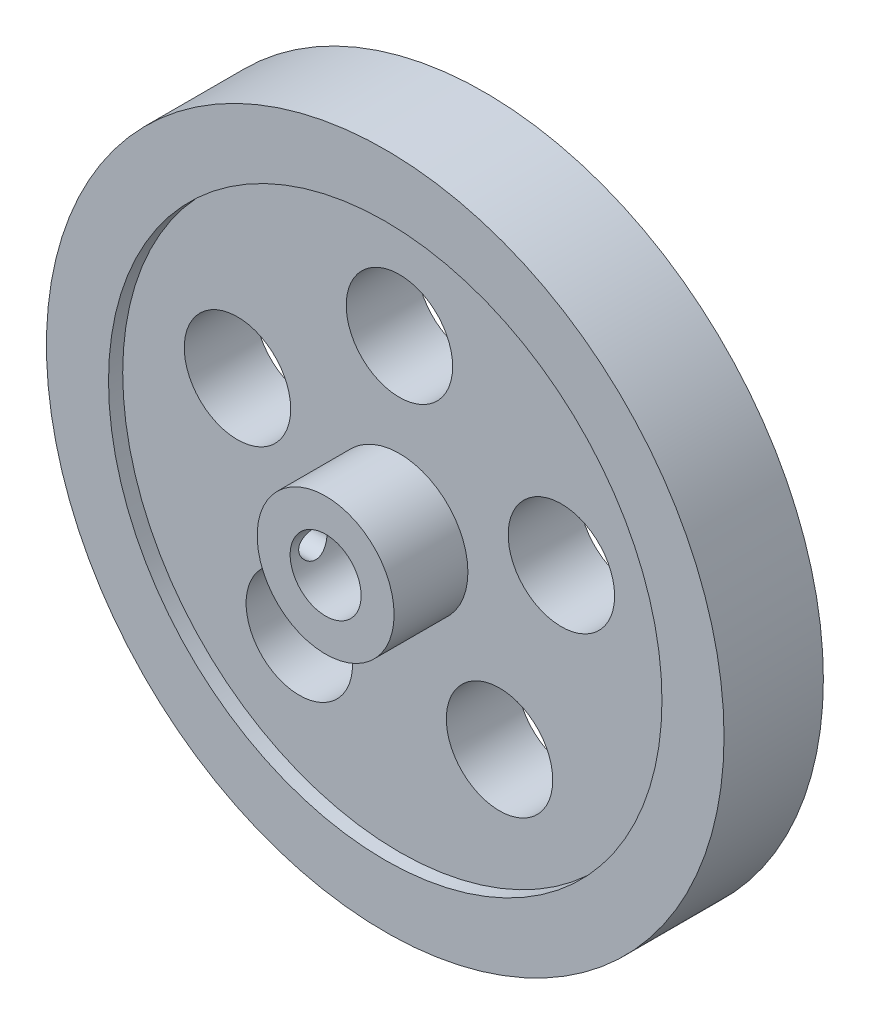
ISO-10303-21;
HEADER;
FILE_DESCRIPTION(('STEP AP214'),'2;1');
FILE_NAME('part.step','',(''),(''),'','','');
FILE_SCHEMA(('AUTOMOTIVE_DESIGN { 1 0 10303 214 1 1 1 1 }'));
ENDSEC;
DATA;
#1=APPLICATION_CONTEXT('core data for automotive mechanical design processes');
#2=APPLICATION_PROTOCOL_DEFINITION('international standard','automotive_design',2000,#1);
#3=PRODUCT_CONTEXT('',#1,'mechanical');
#4=PRODUCT('Part','Part','',(#3));
#5=PRODUCT_RELATED_PRODUCT_CATEGORY('part','',(#4));
#6=PRODUCT_DEFINITION_FORMATION('','',#4);
#7=PRODUCT_DEFINITION_CONTEXT('part definition',#1,'design');
#8=PRODUCT_DEFINITION('design','',#6,#7);
#9=PRODUCT_DEFINITION_SHAPE('','',#8);
#10=(LENGTH_UNIT() NAMED_UNIT(*) SI_UNIT(.MILLI.,.METRE.));
#11=(NAMED_UNIT(*) PLANE_ANGLE_UNIT() SI_UNIT($,.RADIAN.));
#12=(NAMED_UNIT(*) SI_UNIT($,.STERADIAN.) SOLID_ANGLE_UNIT());
#13=UNCERTAINTY_MEASURE_WITH_UNIT(LENGTH_MEASURE(1.E-05),#10,'distance_accuracy_value','');
#14=(GEOMETRIC_REPRESENTATION_CONTEXT(3) GLOBAL_UNCERTAINTY_ASSIGNED_CONTEXT((#13)) GLOBAL_UNIT_ASSIGNED_CONTEXT((#10,
#11,#12)) REPRESENTATION_CONTEXT('',''));
#15=CARTESIAN_POINT('',(0.,0.,0.));
#16=DIRECTION('',(0.,0.,1.));
#17=DIRECTION('',(1.,0.,0.));
#18=AXIS2_PLACEMENT_3D('',#15,#16,#17);
#19=CARTESIAN_POINT('',(0.,0.,0.));
#20=DIRECTION('',(0.,0.,1.));
#21=DIRECTION('',(1.,0.,0.));
#22=AXIS2_PLACEMENT_3D('',#19,#20,#21);
#23=PLANE('',#22);
#24=CARTESIAN_POINT('',(0.,0.,0.));
#25=DIRECTION('',(0.,0.,1.));
#26=DIRECTION('',(1.,0.,0.));
#27=AXIS2_PLACEMENT_3D('',#24,#25,#26);
#28=CIRCLE('',#27,5.);
#29=CARTESIAN_POINT('',(5.,0.,0.));
#30=VERTEX_POINT('',#29);
#31=EDGE_CURVE('E51',#30,#30,#28,.F.);
#32=ORIENTED_EDGE('',*,*,#31,.F.);
#33=EDGE_LOOP('',(#32));
#34=FACE_BOUND('',#33,.T.);
#35=CARTESIAN_POINT('',(0.,0.,0.));
#36=DIRECTION('',(0.,0.,-1.));
#37=DIRECTION('',(-1.,0.,0.));
#38=AXIS2_PLACEMENT_3D('',#35,#36,#37);
#39=CIRCLE('',#38,9.65);
#40=CARTESIAN_POINT('',(-9.65,0.,0.));
#41=VERTEX_POINT('',#40);
#42=EDGE_CURVE('E156',#41,#41,#39,.T.);
#43=ORIENTED_EDGE('',*,*,#42,.T.);
#44=EDGE_LOOP('',(#43));
#45=FACE_BOUND('',#44,.T.);
#46=ADVANCED_FACE('F36',(#34,#45),#23,.F.);
#47=CARTESIAN_POINT('',(0.,0.,14.));
#48=DIRECTION('',(0.,0.,-1.));
#49=DIRECTION('',(-1.,0.,0.));
#50=AXIS2_PLACEMENT_3D('',#47,#48,#49);
#51=CYLINDRICAL_SURFACE('',#50,47.75);
#52=CARTESIAN_POINT('',(0.,0.,14.));
#53=DIRECTION('',(0.,0.,1.));
#54=DIRECTION('',(1.,0.,0.));
#55=AXIS2_PLACEMENT_3D('',#52,#53,#54);
#56=CIRCLE('',#55,47.75);
#57=CARTESIAN_POINT('',(47.75,0.,14.));
#58=VERTEX_POINT('',#57);
#59=EDGE_CURVE('E10',#58,#58,#56,.T.);
#60=ORIENTED_EDGE('',*,*,#59,.F.);
#61=EDGE_LOOP('',(#60));
#62=FACE_BOUND('',#61,.T.);
#63=CARTESIAN_POINT('',(0.,0.,0.));
#64=DIRECTION('',(0.,0.,1.));
#65=DIRECTION('',(1.,0.,0.));
#66=AXIS2_PLACEMENT_3D('',#63,#64,#65);
#67=CIRCLE('',#66,47.75);
#68=CARTESIAN_POINT('',(47.75,0.,0.));
#69=VERTEX_POINT('',#68);
#70=EDGE_CURVE('E40',#69,#69,#67,.T.);
#71=ORIENTED_EDGE('',*,*,#70,.T.);
#72=EDGE_LOOP('',(#71));
#73=FACE_BOUND('',#72,.T.);
#74=ADVANCED_FACE('F38',(#62,#73),#51,.T.);
#75=CARTESIAN_POINT('',(0.,0.,14.));
#76=DIRECTION('',(0.,0.,1.));
#77=DIRECTION('',(1.,0.,0.));
#78=AXIS2_PLACEMENT_3D('',#75,#76,#77);
#79=PLANE('',#78);
#80=CARTESIAN_POINT('',(0.,0.,14.));
#81=DIRECTION('',(0.,0.,1.));
#82=DIRECTION('',(1.,0.,0.));
#83=AXIS2_PLACEMENT_3D('',#80,#81,#82);
#84=CIRCLE('',#83,39.);
#85=CARTESIAN_POINT('',(39.,0.,14.));
#86=VERTEX_POINT('',#85);
#87=EDGE_CURVE('E162',#86,#86,#84,.T.);
#88=ORIENTED_EDGE('',*,*,#87,.F.);
#89=EDGE_LOOP('',(#88));
#90=FACE_BOUND('',#89,.T.);
#91=ORIENTED_EDGE('',*,*,#59,.T.);
#92=EDGE_LOOP('',(#91));
#93=FACE_BOUND('',#92,.T.);
#94=ADVANCED_FACE('F126',(#90,#93),#79,.T.);
#95=CARTESIAN_POINT('',(0.,0.,0.));
#96=DIRECTION('',(0.,0.,-1.));
#97=DIRECTION('',(-1.,0.,0.));
#98=AXIS2_PLACEMENT_3D('',#95,#96,#97);
#99=CIRCLE('',#98,39.);
#100=CARTESIAN_POINT('',(-39.,0.,0.));
#101=VERTEX_POINT('',#100);
#102=EDGE_CURVE('E145',#101,#101,#99,.T.);
#103=ORIENTED_EDGE('',*,*,#102,.F.);
#104=EDGE_LOOP('',(#103));
#105=FACE_BOUND('',#104,.T.);
#106=ORIENTED_EDGE('',*,*,#70,.F.);
#107=EDGE_LOOP('',(#106));
#108=FACE_BOUND('',#107,.T.);
#109=ADVANCED_FACE('F122',(#105,#108),#23,.F.);
#110=CARTESIAN_POINT('',(0.,0.,22.4));
#111=DIRECTION('',(0.,0.,-1.));
#112=DIRECTION('',(-1.,0.,0.));
#113=AXIS2_PLACEMENT_3D('',#110,#111,#112);
#114=CYLINDRICAL_SURFACE('',#113,9.65);
#115=CARTESIAN_POINT('',(-9.65,0.,17.2));
#116=CARTESIAN_POINT('',(-9.64999794464458,-0.111067549874396,17.2000039809148));
#117=CARTESIAN_POINT('',(-9.64806287965716,-0.222184567795648,17.2092832533697));
#118=CARTESIAN_POINT('',(-9.64053026455785,-0.441271956577384,17.2461222853959));
#119=CARTESIAN_POINT('',(-9.63492991522329,-0.549239856534918,17.2736960168918));
#120=CARTESIAN_POINT('',(-9.6206914116801,-0.758830216635555,17.3462308754117));
#121=CARTESIAN_POINT('',(-9.61205626798986,-0.860458848123323,17.3911747756038));
#122=CARTESIAN_POINT('',(-9.59268434466928,-1.05472730461767,17.4971216492004));
#123=CARTESIAN_POINT('',(-9.58194766325775,-1.14736754940868,17.5581238721388));
#124=CARTESIAN_POINT('',(-9.55937831455363,-1.3223776589053,17.6953922736931));
#125=CARTESIAN_POINT('',(-9.54753322683512,-1.40459855250622,17.7718463585199));
#126=CARTESIAN_POINT('',(-9.5241713569897,-1.5551454019171,17.9374444924869));
#127=CARTESIAN_POINT('',(-9.51265460189488,-1.62347021646735,18.0265895828949));
#128=CARTESIAN_POINT('',(-9.49113166207302,-1.74492825527537,18.216122096468));
#129=CARTESIAN_POINT('',(-9.48114143451689,-1.79790558771567,18.3166113927097));
#130=CARTESIAN_POINT('',(-9.46397981260919,-1.88616565866308,18.5253067569492));
#131=CARTESIAN_POINT('',(-9.45680811792375,-1.92145028255944,18.6335120013077));
#132=CARTESIAN_POINT('',(-9.44622156220574,-1.97283641138792,18.8529598441987));
#133=CARTESIAN_POINT('',(-9.44275538644913,-1.98920020228043,18.9641384986318));
#134=CARTESIAN_POINT('',(-9.43981800017677,-2.00309517059189,19.1877130450989));
#135=CARTESIAN_POINT('',(-9.44034635025036,-2.00062841943056,19.3001088018895));
#136=CARTESIAN_POINT('',(-9.44529175763588,-1.97714401267965,19.5209965270891));
#137=CARTESIAN_POINT('',(-9.44964546844672,-1.95642853455584,19.6295222535482));
#138=CARTESIAN_POINT('',(-9.46165114682741,-1.89751235121026,19.8415238001854));
#139=CARTESIAN_POINT('',(-9.46930328236104,-1.85931075554697,19.9449993628982));
#140=CARTESIAN_POINT('',(-9.48710748696465,-1.76622240421973,20.1448260583641));
#141=CARTESIAN_POINT('',(-9.49727719787424,-1.71121723241819,20.2411203904099));
#142=CARTESIAN_POINT('',(-9.51895955139653,-1.58616656369473,20.4232250121083));
#143=CARTESIAN_POINT('',(-9.53047235916012,-1.51611921625328,20.5090340097937));
#144=CARTESIAN_POINT('',(-9.55381714579632,-1.36136159178585,20.66947434836));
#145=CARTESIAN_POINT('',(-9.56565098943414,-1.27639376318513,20.743857210663));
#146=CARTESIAN_POINT('',(-9.58810085982896,-1.09505939888339,20.8773552784657));
#147=CARTESIAN_POINT('',(-9.59871686867413,-0.998692695570653,20.9364702594222));
#148=CARTESIAN_POINT('',(-9.61756405545909,-0.797009794039315,21.0378062548417));
#149=CARTESIAN_POINT('',(-9.62579099573014,-0.691678116619201,21.0799972999809));
#150=CARTESIAN_POINT('',(-9.63890120748899,-0.475212761275096,21.1460144198266));
#151=CARTESIAN_POINT('',(-9.64378491452272,-0.364079841149833,21.1698428868031));
#152=CARTESIAN_POINT('',(-9.64959723648176,-0.141300445319505,21.1981030358968));
#153=CARTESIAN_POINT('',(-9.6505951317267,-0.0296988285568837,21.2028745257505));
#154=CARTESIAN_POINT('',(-9.64871647190994,0.192706883326542,21.1938026408776));
#155=CARTESIAN_POINT('',(-9.64584015151528,0.303511026342835,21.1799603936131));
#156=CARTESIAN_POINT('',(-9.63657973860674,0.520069033230207,21.1343360954804));
#157=CARTESIAN_POINT('',(-9.63023004024345,0.6258615390357,21.1027298645163));
#158=CARTESIAN_POINT('',(-9.61473266780794,0.830644681118043,21.0226680512863));
#159=CARTESIAN_POINT('',(-9.60558477284902,0.929634779664239,20.9742111388041));
#160=CARTESIAN_POINT('',(-9.58533372731224,1.11942571724695,20.8610986191325));
#161=CARTESIAN_POINT('',(-9.57420666740675,1.21010313463923,20.7962402962832));
#162=CARTESIAN_POINT('',(-9.55128484858604,1.37940922834545,20.6524357643333));
#163=CARTESIAN_POINT('',(-9.53949001251252,1.45803650841794,20.5734879249801));
#164=CARTESIAN_POINT('',(-9.51632626631181,1.60233402226305,20.4021936300892));
#165=CARTESIAN_POINT('',(-9.50496753606827,1.6677701856174,20.3096483738895));
#166=CARTESIAN_POINT('',(-9.48418486531277,1.78217055107529,20.114680876373));
#167=CARTESIAN_POINT('',(-9.47476084463142,1.83113543576,20.0122590445746));
#168=CARTESIAN_POINT('',(-9.45899829905757,1.91089136989409,19.8009768822329));
#169=CARTESIAN_POINT('',(-9.45264323260316,1.94178004505181,19.6921546976911));
#170=CARTESIAN_POINT('',(-9.4437049456861,1.98479932688707,19.4707177929529));
#171=CARTESIAN_POINT('',(-9.44112119200855,1.99693258535247,19.3581036111998));
#172=CARTESIAN_POINT('',(-9.44004920141565,2.00199285362991,19.1346331399692));
#173=CARTESIAN_POINT('',(-9.44148199676175,1.99529018257166,19.0237854509742));
#174=CARTESIAN_POINT('',(-9.44810441375105,1.96369014977928,18.8048348783413));
#175=CARTESIAN_POINT('',(-9.4532940001312,1.9387929588277,18.6967319689494));
#176=CARTESIAN_POINT('',(-9.46680873673811,1.87168109239339,18.486597333189));
#177=CARTESIAN_POINT('',(-9.47512507802142,1.82951503860804,18.3845494745906));
#178=CARTESIAN_POINT('',(-9.49396068130323,1.7291062488135,18.1889197883973));
#179=CARTESIAN_POINT('',(-9.50448014520901,1.67086203915069,18.0953387378775));
#180=CARTESIAN_POINT('',(-9.52677618087913,1.53869924868473,17.9174619973726));
#181=CARTESIAN_POINT('',(-9.53857215693292,1.46451454148023,17.8333664351426));
#182=CARTESIAN_POINT('',(-9.56195627064366,1.30312231714444,17.678695508169));
#183=CARTESIAN_POINT('',(-9.57354435984323,1.21591180683035,17.6081232594621));
#184=CARTESIAN_POINT('',(-9.5953630478078,1.02974838920573,17.4817389881261));
#185=CARTESIAN_POINT('',(-9.60557668171413,0.930673051828243,17.4261042368842));
#186=CARTESIAN_POINT('',(-9.6233275921834,0.724392053217509,17.3323631832866));
#187=CARTESIAN_POINT('',(-9.63086721696164,0.617193626299359,17.2942414928798));
#188=CARTESIAN_POINT('',(-9.64100062330069,0.424835856448213,17.2437710937315));
#189=CARTESIAN_POINT('',(-9.64435520949992,0.340751961664246,17.2273869605512));
#190=CARTESIAN_POINT('',(-9.64885564961866,0.171121797952337,17.2055000773237));
#191=CARTESIAN_POINT('',(-9.65000158361499,0.0855755821557099,17.1999969327756));
#192=CARTESIAN_POINT('',(-9.65,0.,17.2));
#193=B_SPLINE_CURVE_WITH_KNOTS('',3,(#115,#116,#117,#118,#119,#120,#121,#122,#123,#124,#125,
#126,#127,#128,#129,#130,#131,#132,#133,#134,#135,#136,#137,#138,#139,#140,#141,#142,#143,#144,
#145,#146,#147,#148,#149,#150,#151,#152,#153,#154,#155,#156,#157,#158,#159,#160,#161,#162,#163,
#164,#165,#166,#167,#168,#169,#170,#171,#172,#173,#174,#175,#176,#177,#178,#179,#180,#181,#182,
#183,#184,#185,#186,#187,#188,#189,#190,#191,#192),.UNSPECIFIED.,.T.,.F.,(4,2,2,2,2,2,2,2,2,2,2,
2,2,2,2,2,2,2,2,2,2,2,2,2,2,2,2,2,2,2,2,2,2,2,2,2,2,2,4),(0.,0.332889521725542,
0.666033572399015,0.998848072414477,1.33164702151236,1.66876710575374,2.00591486588437,
2.34637589811653,2.68680064206304,3.02244750051138,3.35805743726642,3.68821238149429,
4.01838413999704,4.35093852443112,4.68353384385416,5.02256630723218,5.361603756443,
5.70123895884065,6.04082990620445,6.37433777737039,6.70782544837295,7.03806910611385,
7.36833883967369,7.70290919571149,8.03751828893392,8.37762417229575,8.71771595969785,
9.05595361669132,9.39414344661754,9.72573115578423,10.0573157525485,10.3879730987145,
10.718660761559,11.0553704937058,11.3921577173313,11.7327808841835,12.073104183451,
12.3295989700538,12.5860844570157),.UNSPECIFIED.);
#194=CARTESIAN_POINT('',(-9.65,0.,17.2));
#195=VERTEX_POINT('',#194);
#196=EDGE_CURVE('E57',#195,#195,#193,.T.);
#197=ORIENTED_EDGE('',*,*,#196,.F.);
#198=EDGE_LOOP('',(#197));
#199=FACE_BOUND('',#198,.T.);
#200=CARTESIAN_POINT('',(0.,0.,22.4));
#201=DIRECTION('',(0.,0.,1.));
#202=DIRECTION('',(1.,0.,0.));
#203=AXIS2_PLACEMENT_3D('',#200,#201,#202);
#204=CIRCLE('',#203,9.65);
#205=CARTESIAN_POINT('',(9.65,0.,22.4));
#206=VERTEX_POINT('',#205);
#207=EDGE_CURVE('E47',#206,#206,#204,.T.);
#208=ORIENTED_EDGE('',*,*,#207,.F.);
#209=EDGE_LOOP('',(#208));
#210=FACE_BOUND('',#209,.T.);
#211=CARTESIAN_POINT('',(0.,0.,12.));
#212=DIRECTION('',(0.,0.,1.));
#213=DIRECTION('',(1.,0.,0.));
#214=AXIS2_PLACEMENT_3D('',#211,#212,#213);
#215=CIRCLE('',#214,9.65);
#216=CARTESIAN_POINT('',(9.65,0.,12.));
#217=VERTEX_POINT('',#216);
#218=EDGE_CURVE('E153',#217,#217,#215,.T.);
#219=ORIENTED_EDGE('',*,*,#218,.T.);
#220=EDGE_LOOP('',(#219));
#221=FACE_BOUND('',#220,.T.);
#222=ADVANCED_FACE('F132',(#199,#210,#221),#114,.T.);
#223=CARTESIAN_POINT('',(0.,0.,22.4));
#224=DIRECTION('',(0.,0.,1.));
#225=DIRECTION('',(1.,0.,0.));
#226=AXIS2_PLACEMENT_3D('',#223,#224,#225);
#227=PLANE('',#226);
#228=CARTESIAN_POINT('',(0.,0.,22.4));
#229=DIRECTION('',(0.,0.,1.));
#230=DIRECTION('',(1.,0.,0.));
#231=AXIS2_PLACEMENT_3D('',#228,#229,#230);
#232=CIRCLE('',#231,5.);
#233=CARTESIAN_POINT('',(5.,0.,22.4));
#234=VERTEX_POINT('',#233);
#235=EDGE_CURVE('E54',#234,#234,#232,.T.);
#236=ORIENTED_EDGE('',*,*,#235,.F.);
#237=EDGE_LOOP('',(#236));
#238=FACE_BOUND('',#237,.T.);
#239=ORIENTED_EDGE('',*,*,#207,.T.);
#240=EDGE_LOOP('',(#239));
#241=FACE_BOUND('',#240,.T.);
#242=ADVANCED_FACE('F138',(#238,#241),#227,.T.);
#243=CARTESIAN_POINT('',(0.,0.,-14.1421356237309));
#244=DIRECTION('',(0.,0.,1.));
#245=DIRECTION('',(1.,0.,0.));
#246=AXIS2_PLACEMENT_3D('',#243,#244,#245);
#247=CYLINDRICAL_SURFACE('',#246,5.);
#248=CARTESIAN_POINT('',(-5.,0.,17.2));
#249=CARTESIAN_POINT('',(-4.99999271227085,0.107493005442891,17.2000098518237));
#250=CARTESIAN_POINT('',(-4.99649294306933,0.215172564090673,17.2087177520884));
#251=CARTESIAN_POINT('',(-4.98283453100642,0.427496480417896,17.2432477035212));
#252=CARTESIAN_POINT('',(-4.97265778698877,0.532131777561249,17.2691162790861));
#253=CARTESIAN_POINT('',(-4.94674209213118,0.734953922727404,17.3368760780588));
#254=CARTESIAN_POINT('',(-4.93102136364072,0.833160661616959,17.3787148462167));
#255=CARTESIAN_POINT('',(-4.89556610796078,1.02107197032837,17.4770191733265));
#256=CARTESIAN_POINT('',(-4.87583297458057,1.11077947675099,17.5334796549189));
#257=CARTESIAN_POINT('',(-4.83330886170419,1.28350100757039,17.6622354985609));
#258=CARTESIAN_POINT('',(-4.8104229692919,1.36606227255021,17.7351066562403));
#259=CARTESIAN_POINT('',(-4.76460576906194,1.51817500478472,17.8934000034768));
#260=CARTESIAN_POINT('',(-4.74167444453792,1.58772010713353,17.9788282972117));
#261=CARTESIAN_POINT('',(-4.69722791797136,1.71487456729288,18.1644280702423));
#262=CARTESIAN_POINT('',(-4.67582115964951,1.77181498119547,18.2650864860232));
#263=CARTESIAN_POINT('',(-4.63833647186792,1.86775471903715,18.47553639842));
#264=CARTESIAN_POINT('',(-4.62225601244176,1.90676256428584,18.5853235278484));
#265=CARTESIAN_POINT('',(-4.59826357660818,1.96389882339587,18.8057123335921));
#266=CARTESIAN_POINT('',(-4.59001420355605,1.98289396580565,18.9160512355762));
#267=CARTESIAN_POINT('',(-4.58164004049144,2.00217296164003,19.1386349983073));
#268=CARTESIAN_POINT('',(-4.58151125522768,2.00246601631323,19.250878894625));
#269=CARTESIAN_POINT('',(-4.58910500279994,1.98498936750455,19.465756671458));
#270=CARTESIAN_POINT('',(-4.5962817503845,1.96847531430514,19.568515714409));
#271=CARTESIAN_POINT('',(-4.61676187607836,1.91994688029782,19.7696595560067));
#272=CARTESIAN_POINT('',(-4.63006632321673,1.88792979480463,19.8680435881103));
#273=CARTESIAN_POINT('',(-4.6615948508853,1.80869473255107,20.060017836196));
#274=CARTESIAN_POINT('',(-4.67991379280788,1.76117986231532,20.1534692390547));
#275=CARTESIAN_POINT('',(-4.7193811638989,1.65250646073222,20.3314158163616));
#276=CARTESIAN_POINT('',(-4.74053065456848,1.59134280510085,20.4159076094028));
#277=CARTESIAN_POINT('',(-4.78526736742271,1.45155059945444,20.580409728802));
#278=CARTESIAN_POINT('',(-4.80891664976152,1.37193746297064,20.659568729446));
#279=CARTESIAN_POINT('',(-4.85459824958282,1.20031442743019,20.803684478002));
#280=CARTESIAN_POINT('',(-4.87663024445325,1.10830206533443,20.8686383974103));
#281=CARTESIAN_POINT('',(-4.91714681264548,0.912077652605843,20.9836174474158));
#282=CARTESIAN_POINT('',(-4.93555270095415,0.807660491346477,21.0333222811971));
#283=CARTESIAN_POINT('',(-4.96614828328759,0.591023765482881,21.1141678610781));
#284=CARTESIAN_POINT('',(-4.97834113462382,0.478808196849674,21.1453180375574));
#285=CARTESIAN_POINT('',(-4.99456139506911,0.25689588760782,21.1864482954197));
#286=CARTESIAN_POINT('',(-4.99902945833514,0.147443293985535,21.1975724542536));
#287=CARTESIAN_POINT('',(-5.00068478510631,-0.0718453098078173,21.2017131005286));
#288=CARTESIAN_POINT('',(-4.99787393582291,-0.181681213223924,21.1947342815475));
#289=CARTESIAN_POINT('',(-4.98557567063753,-0.393432739121987,21.163708247448));
#290=CARTESIAN_POINT('',(-4.97639391345523,-0.495482491775474,21.140442019649));
#291=CARTESIAN_POINT('',(-4.952594414055,-0.69413542806078,21.0785642916902));
#292=CARTESIAN_POINT('',(-4.9379759735653,-0.790737910224845,21.0399508203313));
#293=CARTESIAN_POINT('',(-4.90416594770812,-0.979078785816702,20.9472150603201));
#294=CARTESIAN_POINT('',(-4.88484815979804,-1.07057802275541,20.8926545279569));
#295=CARTESIAN_POINT('',(-4.84373364745525,-1.24344359124656,20.7700596760944));
#296=CARTESIAN_POINT('',(-4.8219359311027,-1.32480584076113,20.7020199570774));
#297=CARTESIAN_POINT('',(-4.77645117638112,-1.48072304302882,20.5491299870504));
#298=CARTESIAN_POINT('',(-4.75273441425052,-1.55447393380607,20.4634664584938));
#299=CARTESIAN_POINT('',(-4.70741672917132,-1.68675119741371,20.2805599169906));
#300=CARTESIAN_POINT('',(-4.68581615526511,-1.74527506133751,20.1833149996601));
#301=CARTESIAN_POINT('',(-4.64714299907708,-1.84580750193163,19.9785383054059));
#302=CARTESIAN_POINT('',(-4.63011630884788,-1.88765059453445,19.8709160007877));
#303=CARTESIAN_POINT('',(-4.60323673477931,-1.95229621970531,19.6492663482849));
#304=CARTESIAN_POINT('',(-4.59337855695998,-1.97511280526932,19.5352437941876));
#305=CARTESIAN_POINT('',(-4.58271759299926,-1.9997156172784,19.3128720982255));
#306=CARTESIAN_POINT('',(-4.58131421008171,-2.00289708230287,19.2047051604067));
#307=CARTESIAN_POINT('',(-4.58614836033098,-1.99180315927753,18.9894551422867));
#308=CARTESIAN_POINT('',(-4.59238492324793,-1.97752998791378,18.8823719260974));
#309=CARTESIAN_POINT('',(-4.6112664907902,-1.93307136615365,18.676667810145));
#310=CARTESIAN_POINT('',(-4.62364831827449,-1.90353749357098,18.577879725567));
#311=CARTESIAN_POINT('',(-4.65324001232696,-1.83000544849101,18.3866213703865));
#312=CARTESIAN_POINT('',(-4.67045121206007,-1.78600328139382,18.2941528531002));
#313=CARTESIAN_POINT('',(-4.70898609604491,-1.68187276275973,18.1123903807292));
#314=CARTESIAN_POINT('',(-4.73048882313242,-1.62096533515949,18.0235813298695));
#315=CARTESIAN_POINT('',(-4.77463804372237,-1.4858921192715,17.8570066827962));
#316=CARTESIAN_POINT('',(-4.79728488048406,-1.41172233481813,17.7792444278717));
#317=CARTESIAN_POINT('',(-4.84293567087394,-1.24650550627247,17.6317971467364));
#318=CARTESIAN_POINT('',(-4.86586757962185,-1.15467600114614,17.5629626931019));
#319=CARTESIAN_POINT('',(-4.90800406713717,-0.959900320285783,17.4416629573784));
#320=CARTESIAN_POINT('',(-4.92720691092906,-0.85694900454724,17.3892052878475));
#321=CARTESIAN_POINT('',(-4.95939714815861,-0.644738062495205,17.3033777848097));
#322=CARTESIAN_POINT('',(-4.97249363055028,-0.535631618219698,17.2696706764397));
#323=CARTESIAN_POINT('',(-4.99144306209366,-0.312876546281222,17.2213608790457));
#324=CARTESIAN_POINT('',(-4.99731899495638,-0.199243525858913,17.2066975632561));
#325=CARTESIAN_POINT('',(-4.99975899504136,-0.0569122978909301,17.2006046190217));
#326=CARTESIAN_POINT('',(-5.00000192969176,-0.0284626887407586,17.1999973913708));
#327=CARTESIAN_POINT('',(-5.,0.,17.2));
#328=B_SPLINE_CURVE_WITH_KNOTS('',3,(#248,#249,#250,#251,#252,#253,#254,#255,#256,#257,#258,
#259,#260,#261,#262,#263,#264,#265,#266,#267,#268,#269,#270,#271,#272,#273,#274,#275,#276,#277,
#278,#279,#280,#281,#282,#283,#284,#285,#286,#287,#288,#289,#290,#291,#292,#293,#294,#295,#296,
#297,#298,#299,#300,#301,#302,#303,#304,#305,#306,#307,#308,#309,#310,#311,#312,#313,#314,#315,
#316,#317,#318,#319,#320,#321,#322,#323,#324,#325,#326,#327),.UNSPECIFIED.,.T.,.F.,(4,2,2,2,2,2,
2,2,2,2,2,2,2,2,2,2,2,2,2,2,2,2,2,2,2,2,2,2,2,2,2,2,2,2,2,2,2,2,2,4),(0.,0.322402987893071,
0.645683636007935,0.967911457471581,1.29002753567984,1.62597381700397,1.96208394934412,
2.31315258819217,2.66405423118268,2.99904105308829,3.33386306340488,3.64538328401373,
3.95695787256048,4.27489126298817,4.59294421938184,4.93558349186558,5.27829092839734,
5.62776913162807,5.97706956113791,6.30569184528008,6.63422893570083,6.94800455564366,
7.26182048993797,7.58523513398263,7.9087795949897,8.25368474624415,8.59864669043749,
8.94695045140828,9.29499672645935,9.61799673392749,9.94095572563047,10.2511431854877,
10.5614163580516,10.8894546805669,11.2175920134839,11.5670042353384,11.9165786364053,
12.2596430101332,12.6016125240434,12.686980458968),.UNSPECIFIED.);
#329=CARTESIAN_POINT('',(-5.,0.,17.2));
#330=VERTEX_POINT('',#329);
#331=EDGE_CURVE('E65',#330,#330,#328,.T.);
#332=ORIENTED_EDGE('',*,*,#331,.F.);
#333=EDGE_LOOP('',(#332));
#334=FACE_BOUND('',#333,.T.);
#335=ORIENTED_EDGE('',*,*,#31,.T.);
#336=EDGE_LOOP('',(#335));
#337=FACE_BOUND('',#336,.T.);
#338=ORIENTED_EDGE('',*,*,#235,.T.);
#339=EDGE_LOOP('',(#338));
#340=FACE_BOUND('',#339,.T.);
#341=ADVANCED_FACE('F175',(#334,#337,#340),#247,.F.);
#342=CARTESIAN_POINT('',(-47.751,0.,19.2));
#343=DIRECTION('',(1.,0.,0.));
#344=DIRECTION('',(0.,0.,-1.));
#345=AXIS2_PLACEMENT_3D('',#342,#343,#344);
#346=CYLINDRICAL_SURFACE('',#345,2.);
#347=ORIENTED_EDGE('',*,*,#331,.T.);
#348=EDGE_LOOP('',(#347));
#349=FACE_BOUND('',#348,.T.);
#350=ORIENTED_EDGE('',*,*,#196,.T.);
#351=EDGE_LOOP('',(#350));
#352=FACE_BOUND('',#351,.T.);
#353=ADVANCED_FACE('F71',(#349,#352),#346,.F.);
#354=CARTESIAN_POINT('',(0.,0.,12.));
#355=DIRECTION('',(0.,0.,1.));
#356=DIRECTION('',(1.,0.,0.));
#357=AXIS2_PLACEMENT_3D('',#354,#355,#356);
#358=CYLINDRICAL_SURFACE('',#357,39.);
#359=CARTESIAN_POINT('',(0.,0.,12.));
#360=DIRECTION('',(0.,0.,1.));
#361=DIRECTION('',(1.,0.,0.));
#362=AXIS2_PLACEMENT_3D('',#359,#360,#361);
#363=CIRCLE('',#362,39.);
#364=CARTESIAN_POINT('',(39.,0.,12.));
#365=VERTEX_POINT('',#364);
#366=EDGE_CURVE('E163',#365,#365,#363,.T.);
#367=ORIENTED_EDGE('',*,*,#366,.F.);
#368=EDGE_LOOP('',(#367));
#369=FACE_BOUND('',#368,.T.);
#370=ORIENTED_EDGE('',*,*,#87,.T.);
#371=EDGE_LOOP('',(#370));
#372=FACE_BOUND('',#371,.T.);
#373=ADVANCED_FACE('F77',(#369,#372),#358,.F.);
#374=CARTESIAN_POINT('',(0.,0.,12.));
#375=DIRECTION('',(0.,0.,1.));
#376=DIRECTION('',(1.,0.,0.));
#377=AXIS2_PLACEMENT_3D('',#374,#375,#376);
#378=PLANE('',#377);
#379=CARTESIAN_POINT('',(0.,24.,12.));
#380=DIRECTION('',(0.,0.,1.));
#381=DIRECTION('',(1.,0.,0.));
#382=AXIS2_PLACEMENT_3D('',#379,#380,#381);
#383=CIRCLE('',#382,7.5);
#384=CARTESIAN_POINT('',(7.5,24.,12.));
#385=VERTEX_POINT('',#384);
#386=EDGE_CURVE('E333',#385,#385,#383,.T.);
#387=ORIENTED_EDGE('',*,*,#386,.F.);
#388=EDGE_LOOP('',(#387));
#389=FACE_BOUND('',#388,.T.);
#390=CARTESIAN_POINT('',(22.8253563910837,7.41640786499867,12.));
#391=DIRECTION('',(0.,0.,1.));
#392=DIRECTION('',(1.,0.,0.));
#393=AXIS2_PLACEMENT_3D('',#390,#391,#392);
#394=CIRCLE('',#393,7.5);
#395=CARTESIAN_POINT('',(30.3253563910837,7.41640786499867,12.));
#396=VERTEX_POINT('',#395);
#397=EDGE_CURVE('E353',#396,#396,#394,.T.);
#398=ORIENTED_EDGE('',*,*,#397,.F.);
#399=EDGE_LOOP('',(#398));
#400=FACE_BOUND('',#399,.T.);
#401=CARTESIAN_POINT('',(14.1068460550192,-19.4164078649988,12.));
#402=DIRECTION('',(0.,0.,1.));
#403=DIRECTION('',(1.,0.,0.));
#404=AXIS2_PLACEMENT_3D('',#401,#402,#403);
#405=CIRCLE('',#404,7.5);
#406=CARTESIAN_POINT('',(21.6068460550192,-19.4164078649988,12.));
#407=VERTEX_POINT('',#406);
#408=EDGE_CURVE('E347',#407,#407,#405,.T.);
#409=ORIENTED_EDGE('',*,*,#408,.F.);
#410=EDGE_LOOP('',(#409));
#411=FACE_BOUND('',#410,.T.);
#412=CARTESIAN_POINT('',(-14.1068460550195,-19.4164078649986,12.));
#413=DIRECTION('',(0.,0.,1.));
#414=DIRECTION('',(1.,0.,0.));
#415=AXIS2_PLACEMENT_3D('',#412,#413,#414);
#416=CIRCLE('',#415,7.5);
#417=CARTESIAN_POINT('',(-6.60684605501953,-19.4164078649986,12.));
#418=VERTEX_POINT('',#417);
#419=EDGE_CURVE('E341',#418,#418,#416,.T.);
#420=ORIENTED_EDGE('',*,*,#419,.F.);
#421=EDGE_LOOP('',(#420));
#422=FACE_BOUND('',#421,.T.);
#423=CARTESIAN_POINT('',(-22.8253563910836,7.41640786499899,12.));
#424=DIRECTION('',(0.,0.,1.));
#425=DIRECTION('',(1.,0.,0.));
#426=AXIS2_PLACEMENT_3D('',#423,#424,#425);
#427=CIRCLE('',#426,7.5);
#428=CARTESIAN_POINT('',(-15.3253563910836,7.41640786499899,12.));
#429=VERTEX_POINT('',#428);
#430=EDGE_CURVE('E335',#429,#429,#427,.T.);
#431=ORIENTED_EDGE('',*,*,#430,.F.);
#432=EDGE_LOOP('',(#431));
#433=FACE_BOUND('',#432,.T.);
#434=ORIENTED_EDGE('',*,*,#218,.F.);
#435=EDGE_LOOP('',(#434));
#436=FACE_BOUND('',#435,.T.);
#437=ORIENTED_EDGE('',*,*,#366,.T.);
#438=EDGE_LOOP('',(#437));
#439=FACE_BOUND('',#438,.T.);
#440=ADVANCED_FACE('F80',(#389,#400,#411,#422,#433,#436,#439),#378,.T.);
#441=CARTESIAN_POINT('',(0.,0.,2.));
#442=DIRECTION('',(0.,0.,-1.));
#443=DIRECTION('',(-1.,0.,0.));
#444=AXIS2_PLACEMENT_3D('',#441,#442,#443);
#445=CYLINDRICAL_SURFACE('',#444,39.);
#446=CARTESIAN_POINT('',(0.,0.,2.));
#447=DIRECTION('',(0.,0.,-1.));
#448=DIRECTION('',(-1.,0.,0.));
#449=AXIS2_PLACEMENT_3D('',#446,#447,#448);
#450=CIRCLE('',#449,39.);
#451=CARTESIAN_POINT('',(-39.,0.,2.));
#452=VERTEX_POINT('',#451);
#453=EDGE_CURVE('E149',#452,#452,#450,.T.);
#454=ORIENTED_EDGE('',*,*,#453,.F.);
#455=EDGE_LOOP('',(#454));
#456=FACE_BOUND('',#455,.T.);
#457=ORIENTED_EDGE('',*,*,#102,.T.);
#458=EDGE_LOOP('',(#457));
#459=FACE_BOUND('',#458,.T.);
#460=ADVANCED_FACE('F84',(#456,#459),#445,.F.);
#461=CARTESIAN_POINT('',(0.,0.,2.));
#462=DIRECTION('',(0.,0.,-1.));
#463=DIRECTION('',(-1.,0.,0.));
#464=AXIS2_PLACEMENT_3D('',#461,#462,#463);
#465=PLANE('',#464);
#466=CARTESIAN_POINT('',(0.,24.,2.));
#467=DIRECTION('',(0.,0.,-1.));
#468=DIRECTION('',(-1.,0.,0.));
#469=AXIS2_PLACEMENT_3D('',#466,#467,#468);
#470=CIRCLE('',#469,7.5);
#471=CARTESIAN_POINT('',(-7.5,24.,2.));
#472=VERTEX_POINT('',#471);
#473=EDGE_CURVE('E359',#472,#472,#470,.F.);
#474=ORIENTED_EDGE('',*,*,#473,.T.);
#475=EDGE_LOOP('',(#474));
#476=FACE_BOUND('',#475,.T.);
#477=CARTESIAN_POINT('',(22.8253563910837,7.41640786499867,2.));
#478=DIRECTION('',(0.,0.,-1.));
#479=DIRECTION('',(-1.,0.,0.));
#480=AXIS2_PLACEMENT_3D('',#477,#478,#479);
#481=CIRCLE('',#480,7.5);
#482=CARTESIAN_POINT('',(15.3253563910837,7.41640786499867,2.));
#483=VERTEX_POINT('',#482);
#484=EDGE_CURVE('E356',#483,#483,#481,.F.);
#485=ORIENTED_EDGE('',*,*,#484,.T.);
#486=EDGE_LOOP('',(#485));
#487=FACE_BOUND('',#486,.T.);
#488=CARTESIAN_POINT('',(14.1068460550192,-19.4164078649988,2.));
#489=DIRECTION('',(0.,0.,-1.));
#490=DIRECTION('',(-1.,0.,0.));
#491=AXIS2_PLACEMENT_3D('',#488,#489,#490);
#492=CIRCLE('',#491,7.5);
#493=CARTESIAN_POINT('',(6.60684605501925,-19.4164078649988,2.));
#494=VERTEX_POINT('',#493);
#495=EDGE_CURVE('E350',#494,#494,#492,.F.);
#496=ORIENTED_EDGE('',*,*,#495,.T.);
#497=EDGE_LOOP('',(#496));
#498=FACE_BOUND('',#497,.T.);
#499=CARTESIAN_POINT('',(-14.1068460550195,-19.4164078649986,2.));
#500=DIRECTION('',(0.,0.,-1.));
#501=DIRECTION('',(-1.,0.,0.));
#502=AXIS2_PLACEMENT_3D('',#499,#500,#501);
#503=CIRCLE('',#502,7.5);
#504=CARTESIAN_POINT('',(-21.6068460550195,-19.4164078649986,2.));
#505=VERTEX_POINT('',#504);
#506=EDGE_CURVE('E344',#505,#505,#503,.F.);
#507=ORIENTED_EDGE('',*,*,#506,.T.);
#508=EDGE_LOOP('',(#507));
#509=FACE_BOUND('',#508,.T.);
#510=CARTESIAN_POINT('',(-22.8253563910836,7.41640786499899,2.));
#511=DIRECTION('',(0.,0.,-1.));
#512=DIRECTION('',(-1.,0.,0.));
#513=AXIS2_PLACEMENT_3D('',#510,#511,#512);
#514=CIRCLE('',#513,7.5);
#515=CARTESIAN_POINT('',(-30.3253563910836,7.41640786499899,2.));
#516=VERTEX_POINT('',#515);
#517=EDGE_CURVE('E338',#516,#516,#514,.F.);
#518=ORIENTED_EDGE('',*,*,#517,.T.);
#519=EDGE_LOOP('',(#518));
#520=FACE_BOUND('',#519,.T.);
#521=CARTESIAN_POINT('',(0.,0.,2.));
#522=DIRECTION('',(0.,0.,-1.));
#523=DIRECTION('',(-1.,0.,0.));
#524=AXIS2_PLACEMENT_3D('',#521,#522,#523);
#525=CIRCLE('',#524,9.65);
#526=CARTESIAN_POINT('',(-9.65,0.,2.));
#527=VERTEX_POINT('',#526);
#528=EDGE_CURVE('E150',#527,#527,#525,.T.);
#529=ORIENTED_EDGE('',*,*,#528,.F.);
#530=EDGE_LOOP('',(#529));
#531=FACE_BOUND('',#530,.T.);
#532=ORIENTED_EDGE('',*,*,#453,.T.);
#533=EDGE_LOOP('',(#532));
#534=FACE_BOUND('',#533,.T.);
#535=ADVANCED_FACE('F88',(#476,#487,#498,#509,#520,#531,#534),#465,.T.);
#536=CARTESIAN_POINT('',(0.,0.,2.));
#537=DIRECTION('',(0.,0.,-1.));
#538=DIRECTION('',(-1.,0.,0.));
#539=AXIS2_PLACEMENT_3D('',#536,#537,#538);
#540=CYLINDRICAL_SURFACE('',#539,9.65);
#541=ORIENTED_EDGE('',*,*,#528,.T.);
#542=EDGE_LOOP('',(#541));
#543=FACE_BOUND('',#542,.T.);
#544=ORIENTED_EDGE('',*,*,#42,.F.);
#545=EDGE_LOOP('',(#544));
#546=FACE_BOUND('',#545,.T.);
#547=ADVANCED_FACE('F92',(#543,#546),#540,.T.);
#548=CARTESIAN_POINT('',(-22.8253563910836,7.41640786499899,-0.000999999999999265));
#549=DIRECTION('',(0.,0.,1.));
#550=DIRECTION('',(1.,0.,0.));
#551=AXIS2_PLACEMENT_3D('',#548,#549,#550);
#552=CYLINDRICAL_SURFACE('',#551,7.5);
#553=ORIENTED_EDGE('',*,*,#517,.F.);
#554=EDGE_LOOP('',(#553));
#555=FACE_BOUND('',#554,.T.);
#556=ORIENTED_EDGE('',*,*,#430,.T.);
#557=EDGE_LOOP('',(#556));
#558=FACE_BOUND('',#557,.T.);
#559=ADVANCED_FACE('F96',(#555,#558),#552,.F.);
#560=CARTESIAN_POINT('',(-14.1068460550195,-19.4164078649986,-0.000999999999999265));
#561=DIRECTION('',(0.,0.,1.));
#562=DIRECTION('',(1.,0.,0.));
#563=AXIS2_PLACEMENT_3D('',#560,#561,#562);
#564=CYLINDRICAL_SURFACE('',#563,7.5);
#565=ORIENTED_EDGE('',*,*,#506,.F.);
#566=EDGE_LOOP('',(#565));
#567=FACE_BOUND('',#566,.T.);
#568=ORIENTED_EDGE('',*,*,#419,.T.);
#569=EDGE_LOOP('',(#568));
#570=FACE_BOUND('',#569,.T.);
#571=ADVANCED_FACE('F100',(#567,#570),#564,.F.);
#572=CARTESIAN_POINT('',(14.1068460550192,-19.4164078649988,-0.000999999999999265));
#573=DIRECTION('',(0.,0.,1.));
#574=DIRECTION('',(1.,0.,0.));
#575=AXIS2_PLACEMENT_3D('',#572,#573,#574);
#576=CYLINDRICAL_SURFACE('',#575,7.5);
#577=ORIENTED_EDGE('',*,*,#495,.F.);
#578=EDGE_LOOP('',(#577));
#579=FACE_BOUND('',#578,.T.);
#580=ORIENTED_EDGE('',*,*,#408,.T.);
#581=EDGE_LOOP('',(#580));
#582=FACE_BOUND('',#581,.T.);
#583=ADVANCED_FACE('F104',(#579,#582),#576,.F.);
#584=CARTESIAN_POINT('',(22.8253563910837,7.41640786499867,-0.000999999999999265));
#585=DIRECTION('',(0.,0.,1.));
#586=DIRECTION('',(1.,0.,0.));
#587=AXIS2_PLACEMENT_3D('',#584,#585,#586);
#588=CYLINDRICAL_SURFACE('',#587,7.5);
#589=ORIENTED_EDGE('',*,*,#484,.F.);
#590=EDGE_LOOP('',(#589));
#591=FACE_BOUND('',#590,.T.);
#592=ORIENTED_EDGE('',*,*,#397,.T.);
#593=EDGE_LOOP('',(#592));
#594=FACE_BOUND('',#593,.T.);
#595=ADVANCED_FACE('F108',(#591,#594),#588,.F.);
#596=CARTESIAN_POINT('',(0.,24.,-0.000999999999999265));
#597=DIRECTION('',(0.,0.,1.));
#598=DIRECTION('',(1.,0.,0.));
#599=AXIS2_PLACEMENT_3D('',#596,#597,#598);
#600=CYLINDRICAL_SURFACE('',#599,7.5);
#601=ORIENTED_EDGE('',*,*,#473,.F.);
#602=EDGE_LOOP('',(#601));
#603=FACE_BOUND('',#602,.T.);
#604=ORIENTED_EDGE('',*,*,#386,.T.);
#605=EDGE_LOOP('',(#604));
#606=FACE_BOUND('',#605,.T.);
#607=ADVANCED_FACE('F112',(#603,#606),#600,.F.);
#608=CLOSED_SHELL('',(#46,#74,#94,#109,#222,#242,#341,#353,#373,#440,#460,#535,#547,#559,#571,
#583,#595,#607));
#609=MANIFOLD_SOLID_BREP('B2',#608);
#610=ADVANCED_BREP_SHAPE_REPRESENTATION('',(#18,#609),#14);
#611=SHAPE_DEFINITION_REPRESENTATION(#9,#610);
ENDSEC;
END-ISO-10303-21;
